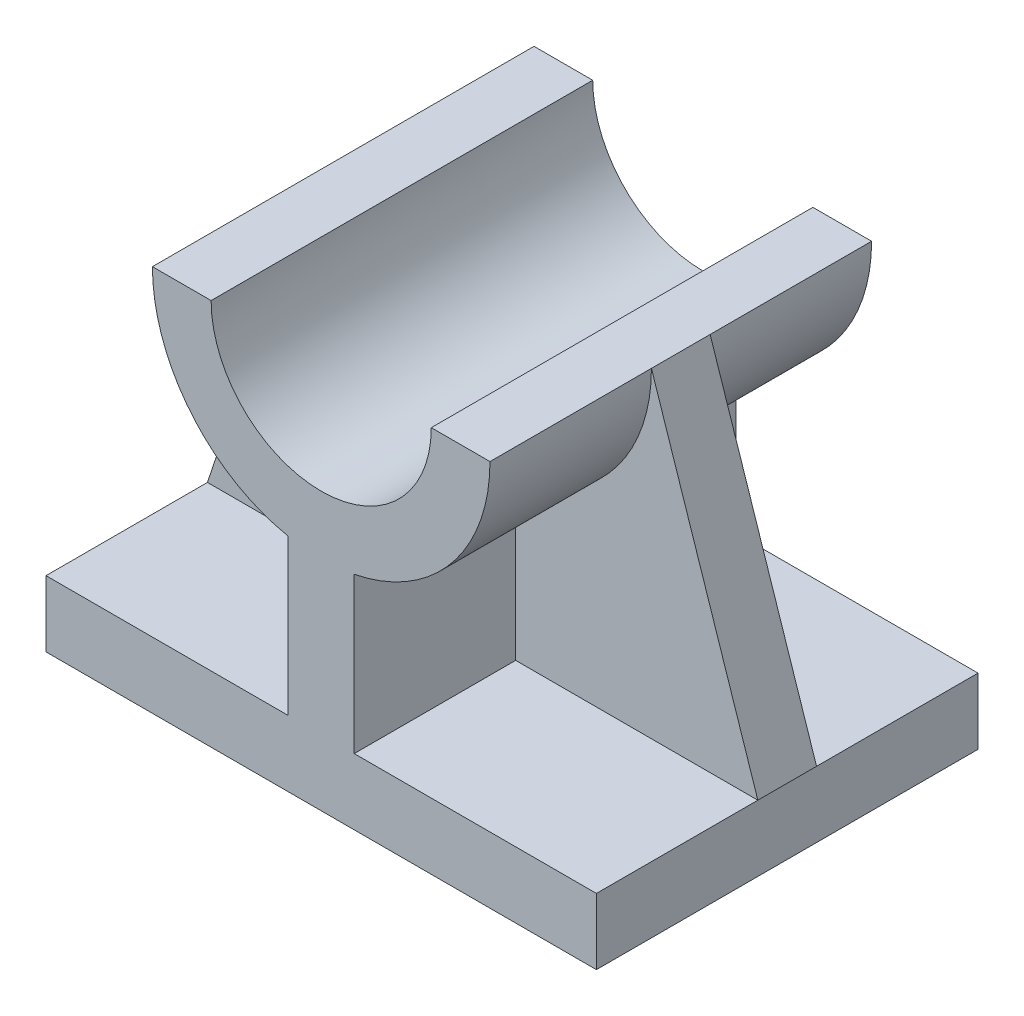
ISO-10303-21;
HEADER;
FILE_DESCRIPTION(('STEP AP214'),'2;1');
FILE_NAME('part.step','',(''),(''),'','','');
FILE_SCHEMA(('AUTOMOTIVE_DESIGN { 1 0 10303 214 1 1 1 1 }'));
ENDSEC;
DATA;
#1=APPLICATION_CONTEXT('core data for automotive mechanical design processes');
#2=APPLICATION_PROTOCOL_DEFINITION('international standard','automotive_design',2000,#1);
#3=PRODUCT_CONTEXT('',#1,'mechanical');
#4=PRODUCT('Part','Part','',(#3));
#5=PRODUCT_RELATED_PRODUCT_CATEGORY('part','',(#4));
#6=PRODUCT_DEFINITION_FORMATION('','',#4);
#7=PRODUCT_DEFINITION_CONTEXT('part definition',#1,'design');
#8=PRODUCT_DEFINITION('design','',#6,#7);
#9=PRODUCT_DEFINITION_SHAPE('','',#8);
#10=(LENGTH_UNIT() NAMED_UNIT(*) SI_UNIT(.MILLI.,.METRE.));
#11=(NAMED_UNIT(*) PLANE_ANGLE_UNIT() SI_UNIT($,.RADIAN.));
#12=(NAMED_UNIT(*) SI_UNIT($,.STERADIAN.) SOLID_ANGLE_UNIT());
#13=UNCERTAINTY_MEASURE_WITH_UNIT(LENGTH_MEASURE(1.E-05),#10,'distance_accuracy_value','');
#14=(GEOMETRIC_REPRESENTATION_CONTEXT(3) GLOBAL_UNCERTAINTY_ASSIGNED_CONTEXT((#13)) GLOBAL_UNIT_ASSIGNED_CONTEXT((#10,
#11,#12)) REPRESENTATION_CONTEXT('',''));
#15=CARTESIAN_POINT('',(0.,0.,0.));
#16=DIRECTION('',(0.,0.,1.));
#17=DIRECTION('',(1.,0.,0.));
#18=AXIS2_PLACEMENT_3D('',#15,#16,#17);
#19=CARTESIAN_POINT('',(0.,16.3928571428572,26.));
#20=DIRECTION('',(0.,0.,-1.));
#21=DIRECTION('',(-1.,0.,0.));
#22=AXIS2_PLACEMENT_3D('',#19,#20,#21);
#23=CYLINDRICAL_SURFACE('',#22,23.);
#24=CARTESIAN_POINT('',(0.,16.3928571428572,-4.));
#25=DIRECTION('',(0.,0.,1.));
#26=DIRECTION('',(1.,0.,0.));
#27=AXIS2_PLACEMENT_3D('',#24,#25,#26);
#28=CIRCLE('',#27,23.);
#29=CARTESIAN_POINT('',(-23.,16.3928571428572,-3.99999999999999));
#30=VERTEX_POINT('',#29);
#31=CARTESIAN_POINT('',(-4.50000000000001,-6.16262999442277,-3.99999999999999));
#32=VERTEX_POINT('',#31);
#33=EDGE_CURVE('E53',#30,#32,#28,.T.);
#34=ORIENTED_EDGE('',*,*,#33,.F.);
#35=DIRECTION('',(0.,0.,-1.));
#36=VECTOR('',#35,1.);
#37=CARTESIAN_POINT('',(-23.,16.3928571428572,26.));
#38=LINE('',#37,#36);
#39=CARTESIAN_POINT('',(-23.,16.3928571428572,-26.));
#40=VERTEX_POINT('',#39);
#41=EDGE_CURVE('E309',#30,#40,#38,.T.);
#42=ORIENTED_EDGE('',*,*,#41,.T.);
#43=CARTESIAN_POINT('',(0.,16.3928571428572,-26.));
#44=DIRECTION('',(0.,0.,1.));
#45=DIRECTION('',(1.,0.,0.));
#46=AXIS2_PLACEMENT_3D('',#43,#44,#45);
#47=CIRCLE('',#46,23.);
#48=CARTESIAN_POINT('',(-4.50000000000001,-6.16262999442277,-26.));
#49=VERTEX_POINT('',#48);
#50=EDGE_CURVE('E293',#40,#49,#47,.T.);
#51=ORIENTED_EDGE('',*,*,#50,.T.);
#52=DIRECTION('',(0.,0.,-1.));
#53=VECTOR('',#52,1.);
#54=CARTESIAN_POINT('',(-4.50000000000001,-6.16262999442277,26.));
#55=LINE('',#54,#53);
#56=EDGE_CURVE('E308',#32,#49,#55,.T.);
#57=ORIENTED_EDGE('',*,*,#56,.F.);
#58=EDGE_LOOP('',(#34,#42,#51,#57));
#59=FACE_BOUND('',#58,.T.);
#60=ADVANCED_FACE('F39',(#59),#23,.T.);
#61=CARTESIAN_POINT('',(-4.5,-27.3214285714286,26.));
#62=DIRECTION('',(1.,0.,0.));
#63=DIRECTION('',(0.,1.,0.));
#64=AXIS2_PLACEMENT_3D('',#61,#62,#63);
#65=PLANE('',#64);
#66=DIRECTION('',(0.,-1.,0.));
#67=VECTOR('',#66,1.);
#68=CARTESIAN_POINT('',(-4.5,-27.3214285714286,-4.));
#69=LINE('',#68,#67);
#70=CARTESIAN_POINT('',(-4.5,-27.3214285714286,-3.99999999999999));
#71=VERTEX_POINT('',#70);
#72=EDGE_CURVE('E204',#32,#71,#69,.T.);
#73=ORIENTED_EDGE('',*,*,#72,.F.);
#74=ORIENTED_EDGE('',*,*,#56,.T.);
#75=DIRECTION('',(0.,-1.,0.));
#76=VECTOR('',#75,1.);
#77=CARTESIAN_POINT('',(-4.5,-27.3214285714286,-26.));
#78=LINE('',#77,#76);
#79=CARTESIAN_POINT('',(-4.5,-27.3214285714286,-26.));
#80=VERTEX_POINT('',#79);
#81=EDGE_CURVE('E299',#49,#80,#78,.T.);
#82=ORIENTED_EDGE('',*,*,#81,.T.);
#83=DIRECTION('',(0.,0.,-1.));
#84=VECTOR('',#83,1.);
#85=CARTESIAN_POINT('',(-4.5,-27.3214285714286,26.));
#86=LINE('',#85,#84);
#87=EDGE_CURVE('E302',#71,#80,#86,.T.);
#88=ORIENTED_EDGE('',*,*,#87,.F.);
#89=EDGE_LOOP('',(#73,#74,#82,#88));
#90=FACE_BOUND('',#89,.T.);
#91=ADVANCED_FACE('F370',(#90),#65,.F.);
#92=CARTESIAN_POINT('',(-37.5,-27.3214285714286,26.));
#93=DIRECTION('',(0.,-1.,0.));
#94=DIRECTION('',(0.,0.,-1.));
#95=AXIS2_PLACEMENT_3D('',#92,#93,#94);
#96=PLANE('',#95);
#97=DIRECTION('',(-1.,0.,0.));
#98=VECTOR('',#97,1.);
#99=CARTESIAN_POINT('',(-37.5,-27.3214285714286,-4.));
#100=LINE('',#99,#98);
#101=CARTESIAN_POINT('',(-37.5,-27.3214285714286,-4.));
#102=VERTEX_POINT('',#101);
#103=EDGE_CURVE('E194',#71,#102,#100,.T.);
#104=ORIENTED_EDGE('',*,*,#103,.F.);
#105=ORIENTED_EDGE('',*,*,#87,.T.);
#106=DIRECTION('',(-1.,0.,0.));
#107=VECTOR('',#106,1.);
#108=CARTESIAN_POINT('',(-37.5,-27.3214285714286,-26.));
#109=LINE('',#108,#107);
#110=CARTESIAN_POINT('',(-37.5,-27.3214285714286,-26.));
#111=VERTEX_POINT('',#110);
#112=EDGE_CURVE('E198',#80,#111,#109,.T.);
#113=ORIENTED_EDGE('',*,*,#112,.T.);
#114=DIRECTION('',(0.,0.,-1.));
#115=VECTOR('',#114,1.);
#116=CARTESIAN_POINT('',(-37.5,-27.3214285714286,26.));
#117=LINE('',#116,#115);
#118=EDGE_CURVE('E180',#102,#111,#117,.T.);
#119=ORIENTED_EDGE('',*,*,#118,.F.);
#120=EDGE_LOOP('',(#104,#105,#113,#119));
#121=FACE_BOUND('',#120,.T.);
#122=ADVANCED_FACE('F192',(#121),#96,.F.);
#123=CARTESIAN_POINT('',(4.5,-27.3214285714286,26.));
#124=DIRECTION('',(0.,-1.,0.));
#125=DIRECTION('',(0.,0.,-1.));
#126=AXIS2_PLACEMENT_3D('',#123,#124,#125);
#127=PLANE('',#126);
#128=DIRECTION('',(-1.,0.,0.));
#129=VECTOR('',#128,1.);
#130=CARTESIAN_POINT('',(4.5,-27.3214285714286,-4.));
#131=LINE('',#130,#129);
#132=CARTESIAN_POINT('',(37.5,-27.3214285714286,-4.));
#133=VERTEX_POINT('',#132);
#134=CARTESIAN_POINT('',(4.5,-27.3214285714286,-4.));
#135=VERTEX_POINT('',#134);
#136=EDGE_CURVE('E231',#133,#135,#131,.T.);
#137=ORIENTED_EDGE('',*,*,#136,.F.);
#138=DIRECTION('',(0.,0.,-1.));
#139=VECTOR('',#138,1.);
#140=CARTESIAN_POINT('',(37.5,-27.3214285714286,26.));
#141=LINE('',#140,#139);
#142=CARTESIAN_POINT('',(37.5,-27.3214285714286,-26.));
#143=VERTEX_POINT('',#142);
#144=EDGE_CURVE('E329',#133,#143,#141,.T.);
#145=ORIENTED_EDGE('',*,*,#144,.T.);
#146=DIRECTION('',(-1.,0.,0.));
#147=VECTOR('',#146,1.);
#148=CARTESIAN_POINT('',(4.5,-27.3214285714286,-26.));
#149=LINE('',#148,#147);
#150=CARTESIAN_POINT('',(4.5,-27.3214285714286,-26.));
#151=VERTEX_POINT('',#150);
#152=EDGE_CURVE('E280',#143,#151,#149,.T.);
#153=ORIENTED_EDGE('',*,*,#152,.T.);
#154=DIRECTION('',(0.,0.,-1.));
#155=VECTOR('',#154,1.);
#156=CARTESIAN_POINT('',(4.5,-27.3214285714286,26.));
#157=LINE('',#156,#155);
#158=EDGE_CURVE('E326',#135,#151,#157,.T.);
#159=ORIENTED_EDGE('',*,*,#158,.F.);
#160=EDGE_LOOP('',(#137,#145,#153,#159));
#161=FACE_BOUND('',#160,.T.);
#162=ADVANCED_FACE('F355',(#161),#127,.F.);
#163=CARTESIAN_POINT('',(4.5,-27.3214285714286,26.));
#164=DIRECTION('',(-1.,0.,0.));
#165=DIRECTION('',(0.,-1.,0.));
#166=AXIS2_PLACEMENT_3D('',#163,#164,#165);
#167=PLANE('',#166);
#168=DIRECTION('',(0.,1.,0.));
#169=VECTOR('',#168,1.);
#170=CARTESIAN_POINT('',(4.5,-27.3214285714286,-4.));
#171=LINE('',#170,#169);
#172=CARTESIAN_POINT('',(4.50000000000001,-6.16262999442277,-4.));
#173=VERTEX_POINT('',#172);
#174=EDGE_CURVE('E226',#135,#173,#171,.T.);
#175=ORIENTED_EDGE('',*,*,#174,.F.);
#176=ORIENTED_EDGE('',*,*,#158,.T.);
#177=DIRECTION('',(0.,1.,0.));
#178=VECTOR('',#177,1.);
#179=CARTESIAN_POINT('',(4.5,-27.3214285714286,-26.));
#180=LINE('',#179,#178);
#181=CARTESIAN_POINT('',(4.50000000000001,-6.16262999442277,-26.));
#182=VERTEX_POINT('',#181);
#183=EDGE_CURVE('E278',#151,#182,#180,.T.);
#184=ORIENTED_EDGE('',*,*,#183,.T.);
#185=DIRECTION('',(0.,0.,-1.));
#186=VECTOR('',#185,1.);
#187=CARTESIAN_POINT('',(4.50000000000001,-6.16262999442277,26.));
#188=LINE('',#187,#186);
#189=EDGE_CURVE('E321',#173,#182,#188,.T.);
#190=ORIENTED_EDGE('',*,*,#189,.F.);
#191=EDGE_LOOP('',(#175,#176,#184,#190));
#192=FACE_BOUND('',#191,.T.);
#193=ADVANCED_FACE('F389',(#192),#167,.F.);
#194=CARTESIAN_POINT('',(0.,16.3928571428572,26.));
#195=DIRECTION('',(0.,0.,-1.));
#196=DIRECTION('',(-1.,0.,0.));
#197=AXIS2_PLACEMENT_3D('',#194,#195,#196);
#198=CYLINDRICAL_SURFACE('',#197,23.);
#199=CARTESIAN_POINT('',(0.,16.3928571428572,-4.));
#200=DIRECTION('',(0.,0.,1.));
#201=DIRECTION('',(1.,0.,0.));
#202=AXIS2_PLACEMENT_3D('',#199,#200,#201);
#203=CIRCLE('',#202,23.);
#204=CARTESIAN_POINT('',(23.,16.3928571428572,-3.99999999999999));
#205=VERTEX_POINT('',#204);
#206=EDGE_CURVE('E221',#173,#205,#203,.T.);
#207=ORIENTED_EDGE('',*,*,#206,.F.);
#208=ORIENTED_EDGE('',*,*,#189,.T.);
#209=CARTESIAN_POINT('',(0.,16.3928571428572,-26.));
#210=DIRECTION('',(0.,0.,1.));
#211=DIRECTION('',(1.,0.,0.));
#212=AXIS2_PLACEMENT_3D('',#209,#210,#211);
#213=CIRCLE('',#212,23.);
#214=CARTESIAN_POINT('',(23.,16.3928571428572,-26.));
#215=VERTEX_POINT('',#214);
#216=EDGE_CURVE('E284',#182,#215,#213,.T.);
#217=ORIENTED_EDGE('',*,*,#216,.T.);
#218=DIRECTION('',(0.,0.,-1.));
#219=VECTOR('',#218,1.);
#220=CARTESIAN_POINT('',(23.,16.3928571428572,26.));
#221=LINE('',#220,#219);
#222=EDGE_CURVE('E320',#205,#215,#221,.T.);
#223=ORIENTED_EDGE('',*,*,#222,.F.);
#224=EDGE_LOOP('',(#207,#208,#217,#223));
#225=FACE_BOUND('',#224,.T.);
#226=ADVANCED_FACE('F383',(#225),#198,.T.);
#227=CARTESIAN_POINT('',(-37.5,-27.3214285714286,26.));
#228=DIRECTION('',(1.,0.,0.));
#229=DIRECTION('',(0.,1.,0.));
#230=AXIS2_PLACEMENT_3D('',#227,#228,#229);
#231=PLANE('',#230);
#232=CARTESIAN_POINT('',(-37.5,-27.3214285714286,26.));
#233=VERTEX_POINT('',#232);
#234=CARTESIAN_POINT('',(-37.5,-27.3214285714286,4.00000000000001));
#235=VERTEX_POINT('',#234);
#236=EDGE_CURVE('E184',#233,#235,#117,.T.);
#237=ORIENTED_EDGE('',*,*,#236,.T.);
#238=EDGE_CURVE('E177',#235,#102,#117,.T.);
#239=ORIENTED_EDGE('',*,*,#238,.T.);
#240=ORIENTED_EDGE('',*,*,#118,.T.);
#241=DIRECTION('',(0.,-1.,0.));
#242=VECTOR('',#241,1.);
#243=CARTESIAN_POINT('',(-37.5,-27.3214285714286,-26.));
#244=LINE('',#243,#242);
#245=CARTESIAN_POINT('',(-37.5,-36.3214285714286,-26.));
#246=VERTEX_POINT('',#245);
#247=EDGE_CURVE('E243',#111,#246,#244,.T.);
#248=ORIENTED_EDGE('',*,*,#247,.T.);
#249=DIRECTION('',(0.,0.,-1.));
#250=VECTOR('',#249,1.);
#251=CARTESIAN_POINT('',(-37.5,-36.3214285714286,26.));
#252=LINE('',#251,#250);
#253=CARTESIAN_POINT('',(-37.5,-36.3214285714286,26.));
#254=VERTEX_POINT('',#253);
#255=EDGE_CURVE('E11',#254,#246,#252,.T.);
#256=ORIENTED_EDGE('',*,*,#255,.F.);
#257=DIRECTION('',(0.,-1.,0.));
#258=VECTOR('',#257,1.);
#259=CARTESIAN_POINT('',(-37.5,-27.3214285714286,26.));
#260=LINE('',#259,#258);
#261=EDGE_CURVE('E246',#233,#254,#260,.T.);
#262=ORIENTED_EDGE('',*,*,#261,.F.);
#263=EDGE_LOOP('',(#237,#239,#240,#248,#256,#262));
#264=FACE_BOUND('',#263,.T.);
#265=ADVANCED_FACE('F41',(#264),#231,.F.);
#266=CARTESIAN_POINT('',(-37.5,-36.3214285714286,26.));
#267=DIRECTION('',(0.,1.,0.));
#268=DIRECTION('',(0.,0.,1.));
#269=AXIS2_PLACEMENT_3D('',#266,#267,#268);
#270=PLANE('',#269);
#271=ORIENTED_EDGE('',*,*,#255,.T.);
#272=DIRECTION('',(1.,0.,0.));
#273=VECTOR('',#272,1.);
#274=CARTESIAN_POINT('',(-37.5,-36.3214285714286,-26.));
#275=LINE('',#274,#273);
#276=CARTESIAN_POINT('',(37.5,-36.3214285714286,-26.));
#277=VERTEX_POINT('',#276);
#278=EDGE_CURVE('E271',#246,#277,#275,.T.);
#279=ORIENTED_EDGE('',*,*,#278,.T.);
#280=DIRECTION('',(0.,0.,-1.));
#281=VECTOR('',#280,1.);
#282=CARTESIAN_POINT('',(37.5,-36.3214285714286,26.));
#283=LINE('',#282,#281);
#284=CARTESIAN_POINT('',(37.5,-36.3214285714286,26.));
#285=VERTEX_POINT('',#284);
#286=EDGE_CURVE('E50',#285,#277,#283,.T.);
#287=ORIENTED_EDGE('',*,*,#286,.F.);
#288=DIRECTION('',(1.,0.,0.));
#289=VECTOR('',#288,1.);
#290=CARTESIAN_POINT('',(-37.5,-36.3214285714286,26.));
#291=LINE('',#290,#289);
#292=EDGE_CURVE('E248',#254,#285,#291,.T.);
#293=ORIENTED_EDGE('',*,*,#292,.F.);
#294=EDGE_LOOP('',(#271,#279,#287,#293));
#295=FACE_BOUND('',#294,.T.);
#296=ADVANCED_FACE('F344',(#295),#270,.F.);
#297=CARTESIAN_POINT('',(37.5,-27.3214285714286,26.));
#298=DIRECTION('',(-1.,0.,0.));
#299=DIRECTION('',(0.,-1.,0.));
#300=AXIS2_PLACEMENT_3D('',#297,#298,#299);
#301=PLANE('',#300);
#302=ORIENTED_EDGE('',*,*,#286,.T.);
#303=DIRECTION('',(0.,1.,0.));
#304=VECTOR('',#303,1.);
#305=CARTESIAN_POINT('',(37.5,-27.3214285714286,-26.));
#306=LINE('',#305,#304);
#307=EDGE_CURVE('E273',#277,#143,#306,.T.);
#308=ORIENTED_EDGE('',*,*,#307,.T.);
#309=ORIENTED_EDGE('',*,*,#144,.F.);
#310=DIRECTION('',(0.,0.,-1.));
#311=VECTOR('',#310,1.);
#312=CARTESIAN_POINT('',(37.5,-27.3214285714286,26.));
#313=LINE('',#312,#311);
#314=CARTESIAN_POINT('',(37.5,-27.3214285714286,4.));
#315=VERTEX_POINT('',#314);
#316=EDGE_CURVE('E245',#133,#315,#313,.F.);
#317=ORIENTED_EDGE('',*,*,#316,.T.);
#318=CARTESIAN_POINT('',(37.5,-27.3214285714286,26.));
#319=VERTEX_POINT('',#318);
#320=EDGE_CURVE('E332',#319,#315,#141,.T.);
#321=ORIENTED_EDGE('',*,*,#320,.F.);
#322=DIRECTION('',(0.,1.,0.));
#323=VECTOR('',#322,1.);
#324=CARTESIAN_POINT('',(37.5,-27.3214285714286,26.));
#325=LINE('',#324,#323);
#326=EDGE_CURVE('E253',#285,#319,#325,.T.);
#327=ORIENTED_EDGE('',*,*,#326,.F.);
#328=EDGE_LOOP('',(#302,#308,#309,#317,#321,#327));
#329=FACE_BOUND('',#328,.T.);
#330=ADVANCED_FACE('F337',(#329),#301,.F.);
#331=ORIENTED_EDGE('',*,*,#320,.T.);
#332=DIRECTION('',(-1.,0.,0.));
#333=VECTOR('',#332,1.);
#334=CARTESIAN_POINT('',(4.5,-27.3214285714286,4.));
#335=LINE('',#334,#333);
#336=CARTESIAN_POINT('',(4.5,-27.3214285714286,4.));
#337=VERTEX_POINT('',#336);
#338=EDGE_CURVE('E239',#315,#337,#335,.T.);
#339=ORIENTED_EDGE('',*,*,#338,.T.);
#340=CARTESIAN_POINT('',(4.5,-27.3214285714286,26.));
#341=VERTEX_POINT('',#340);
#342=EDGE_CURVE('E330',#341,#337,#157,.T.);
#343=ORIENTED_EDGE('',*,*,#342,.F.);
#344=DIRECTION('',(-1.,0.,0.));
#345=VECTOR('',#344,1.);
#346=CARTESIAN_POINT('',(4.5,-27.3214285714286,26.));
#347=LINE('',#346,#345);
#348=EDGE_CURVE('E251',#319,#341,#347,.T.);
#349=ORIENTED_EDGE('',*,*,#348,.F.);
#350=EDGE_LOOP('',(#331,#339,#343,#349));
#351=FACE_BOUND('',#350,.T.);
#352=ADVANCED_FACE('F356',(#351),#127,.F.);
#353=ORIENTED_EDGE('',*,*,#342,.T.);
#354=DIRECTION('',(0.,1.,0.));
#355=VECTOR('',#354,1.);
#356=CARTESIAN_POINT('',(4.5,-27.3214285714286,4.));
#357=LINE('',#356,#355);
#358=CARTESIAN_POINT('',(4.50000000000001,-6.16262999442277,4.));
#359=VERTEX_POINT('',#358);
#360=EDGE_CURVE('E237',#337,#359,#357,.T.);
#361=ORIENTED_EDGE('',*,*,#360,.T.);
#362=CARTESIAN_POINT('',(4.50000000000001,-6.16262999442277,26.));
#363=VERTEX_POINT('',#362);
#364=EDGE_CURVE('E323',#363,#359,#188,.T.);
#365=ORIENTED_EDGE('',*,*,#364,.F.);
#366=DIRECTION('',(0.,1.,0.));
#367=VECTOR('',#366,1.);
#368=CARTESIAN_POINT('',(4.5,-27.3214285714286,26.));
#369=LINE('',#368,#367);
#370=EDGE_CURVE('E254',#341,#363,#369,.T.);
#371=ORIENTED_EDGE('',*,*,#370,.F.);
#372=EDGE_LOOP('',(#353,#361,#365,#371));
#373=FACE_BOUND('',#372,.T.);
#374=ADVANCED_FACE('F441',(#373),#167,.F.);
#375=ORIENTED_EDGE('',*,*,#364,.T.);
#376=CARTESIAN_POINT('',(0.,16.3928571428572,4.));
#377=DIRECTION('',(0.,0.,1.));
#378=DIRECTION('',(1.,0.,0.));
#379=AXIS2_PLACEMENT_3D('',#376,#377,#378);
#380=CIRCLE('',#379,23.);
#381=CARTESIAN_POINT('',(23.,16.3928571428572,4.));
#382=VERTEX_POINT('',#381);
#383=EDGE_CURVE('E234',#359,#382,#380,.T.);
#384=ORIENTED_EDGE('',*,*,#383,.T.);
#385=CARTESIAN_POINT('',(23.,16.3928571428572,26.));
#386=VERTEX_POINT('',#385);
#387=EDGE_CURVE('E318',#386,#382,#221,.T.);
#388=ORIENTED_EDGE('',*,*,#387,.F.);
#389=CARTESIAN_POINT('',(0.,16.3928571428572,26.));
#390=DIRECTION('',(0.,0.,1.));
#391=DIRECTION('',(1.,0.,0.));
#392=AXIS2_PLACEMENT_3D('',#389,#390,#391);
#393=CIRCLE('',#392,23.);
#394=EDGE_CURVE('E260',#363,#386,#393,.T.);
#395=ORIENTED_EDGE('',*,*,#394,.F.);
#396=EDGE_LOOP('',(#375,#384,#388,#395));
#397=FACE_BOUND('',#396,.T.);
#398=ADVANCED_FACE('F397',(#397),#198,.T.);
#399=CARTESIAN_POINT('',(15.,16.3928571428572,26.));
#400=DIRECTION('',(0.,-1.,0.));
#401=DIRECTION('',(0.,0.,-1.));
#402=AXIS2_PLACEMENT_3D('',#399,#400,#401);
#403=PLANE('',#402);
#404=ORIENTED_EDGE('',*,*,#387,.T.);
#405=EDGE_CURVE('E325',#382,#205,#221,.T.);
#406=ORIENTED_EDGE('',*,*,#405,.T.);
#407=ORIENTED_EDGE('',*,*,#222,.T.);
#408=DIRECTION('',(-1.,0.,0.));
#409=VECTOR('',#408,1.);
#410=CARTESIAN_POINT('',(15.,16.3928571428572,-26.));
#411=LINE('',#410,#409);
#412=CARTESIAN_POINT('',(15.,16.3928571428572,-26.));
#413=VERTEX_POINT('',#412);
#414=EDGE_CURVE('E286',#215,#413,#411,.T.);
#415=ORIENTED_EDGE('',*,*,#414,.T.);
#416=DIRECTION('',(0.,0.,-1.));
#417=VECTOR('',#416,1.);
#418=CARTESIAN_POINT('',(15.,16.3928571428572,26.));
#419=LINE('',#418,#417);
#420=CARTESIAN_POINT('',(15.,16.3928571428572,26.));
#421=VERTEX_POINT('',#420);
#422=EDGE_CURVE('E312',#421,#413,#419,.T.);
#423=ORIENTED_EDGE('',*,*,#422,.F.);
#424=DIRECTION('',(-1.,0.,0.));
#425=VECTOR('',#424,1.);
#426=CARTESIAN_POINT('',(15.,16.3928571428572,26.));
#427=LINE('',#426,#425);
#428=EDGE_CURVE('E259',#386,#421,#427,.T.);
#429=ORIENTED_EDGE('',*,*,#428,.F.);
#430=EDGE_LOOP('',(#404,#406,#407,#415,#423,#429));
#431=FACE_BOUND('',#430,.T.);
#432=ADVANCED_FACE('F377',(#431),#403,.F.);
#433=CARTESIAN_POINT('',(0.,16.3928571428572,26.));
#434=DIRECTION('',(0.,0.,-1.));
#435=DIRECTION('',(-1.,0.,0.));
#436=AXIS2_PLACEMENT_3D('',#433,#434,#435);
#437=CYLINDRICAL_SURFACE('',#436,15.);
#438=ORIENTED_EDGE('',*,*,#422,.T.);
#439=CARTESIAN_POINT('',(0.,16.3928571428572,-26.));
#440=DIRECTION('',(0.,0.,-1.));
#441=DIRECTION('',(1.,0.,0.));
#442=AXIS2_PLACEMENT_3D('',#439,#440,#441);
#443=CIRCLE('',#442,15.);
#444=CARTESIAN_POINT('',(-15.,16.3928571428572,-26.));
#445=VERTEX_POINT('',#444);
#446=EDGE_CURVE('E288',#413,#445,#443,.T.);
#447=ORIENTED_EDGE('',*,*,#446,.T.);
#448=DIRECTION('',(0.,0.,-1.));
#449=VECTOR('',#448,1.);
#450=CARTESIAN_POINT('',(-15.,16.3928571428572,26.));
#451=LINE('',#450,#449);
#452=CARTESIAN_POINT('',(-15.,16.3928571428572,26.));
#453=VERTEX_POINT('',#452);
#454=EDGE_CURVE('E311',#453,#445,#451,.T.);
#455=ORIENTED_EDGE('',*,*,#454,.F.);
#456=CARTESIAN_POINT('',(0.,16.3928571428572,26.));
#457=DIRECTION('',(0.,0.,-1.));
#458=DIRECTION('',(1.,0.,0.));
#459=AXIS2_PLACEMENT_3D('',#456,#457,#458);
#460=CIRCLE('',#459,15.);
#461=EDGE_CURVE('E261',#421,#453,#460,.T.);
#462=ORIENTED_EDGE('',*,*,#461,.F.);
#463=EDGE_LOOP('',(#438,#447,#455,#462));
#464=FACE_BOUND('',#463,.T.);
#465=ADVANCED_FACE('F372',(#464),#437,.F.);
#466=CARTESIAN_POINT('',(-23.,16.3928571428572,26.));
#467=DIRECTION('',(0.,-1.,0.));
#468=DIRECTION('',(0.,0.,-1.));
#469=AXIS2_PLACEMENT_3D('',#466,#467,#468);
#470=PLANE('',#469);
#471=ORIENTED_EDGE('',*,*,#454,.T.);
#472=DIRECTION('',(-1.,0.,0.));
#473=VECTOR('',#472,1.);
#474=CARTESIAN_POINT('',(-23.,16.3928571428572,-26.));
#475=LINE('',#474,#473);
#476=EDGE_CURVE('E295',#445,#40,#475,.T.);
#477=ORIENTED_EDGE('',*,*,#476,.T.);
#478=ORIENTED_EDGE('',*,*,#41,.F.);
#479=DIRECTION('',(0.,0.,-1.));
#480=VECTOR('',#479,1.);
#481=CARTESIAN_POINT('',(-23.,16.3928571428572,26.));
#482=LINE('',#481,#480);
#483=CARTESIAN_POINT('',(-23.,16.3928571428572,4.00000000000001));
#484=VERTEX_POINT('',#483);
#485=EDGE_CURVE('E62',#30,#484,#482,.F.);
#486=ORIENTED_EDGE('',*,*,#485,.T.);
#487=CARTESIAN_POINT('',(-23.,16.3928571428572,26.));
#488=VERTEX_POINT('',#487);
#489=EDGE_CURVE('E313',#488,#484,#38,.T.);
#490=ORIENTED_EDGE('',*,*,#489,.F.);
#491=DIRECTION('',(-1.,0.,0.));
#492=VECTOR('',#491,1.);
#493=CARTESIAN_POINT('',(-23.,16.3928571428572,26.));
#494=LINE('',#493,#492);
#495=EDGE_CURVE('E263',#453,#488,#494,.T.);
#496=ORIENTED_EDGE('',*,*,#495,.F.);
#497=EDGE_LOOP('',(#471,#477,#478,#486,#490,#496));
#498=FACE_BOUND('',#497,.T.);
#499=ADVANCED_FACE('F366',(#498),#470,.F.);
#500=ORIENTED_EDGE('',*,*,#489,.T.);
#501=CARTESIAN_POINT('',(0.,16.3928571428572,4.));
#502=DIRECTION('',(0.,0.,1.));
#503=DIRECTION('',(1.,0.,0.));
#504=AXIS2_PLACEMENT_3D('',#501,#502,#503);
#505=CIRCLE('',#504,23.);
#506=CARTESIAN_POINT('',(-4.50000000000001,-6.16262999442277,4.00000000000001));
#507=VERTEX_POINT('',#506);
#508=EDGE_CURVE('E213',#484,#507,#505,.T.);
#509=ORIENTED_EDGE('',*,*,#508,.T.);
#510=CARTESIAN_POINT('',(-4.50000000000001,-6.16262999442277,26.));
#511=VERTEX_POINT('',#510);
#512=EDGE_CURVE('E307',#511,#507,#55,.T.);
#513=ORIENTED_EDGE('',*,*,#512,.F.);
#514=CARTESIAN_POINT('',(0.,16.3928571428572,26.));
#515=DIRECTION('',(0.,0.,1.));
#516=DIRECTION('',(1.,0.,0.));
#517=AXIS2_PLACEMENT_3D('',#514,#515,#516);
#518=CIRCLE('',#517,23.);
#519=EDGE_CURVE('E264',#488,#511,#518,.T.);
#520=ORIENTED_EDGE('',*,*,#519,.F.);
#521=EDGE_LOOP('',(#500,#509,#513,#520));
#522=FACE_BOUND('',#521,.T.);
#523=ADVANCED_FACE('F401',(#522),#23,.T.);
#524=ORIENTED_EDGE('',*,*,#512,.T.);
#525=DIRECTION('',(0.,-1.,0.));
#526=VECTOR('',#525,1.);
#527=CARTESIAN_POINT('',(-4.5,-27.3214285714286,4.));
#528=LINE('',#527,#526);
#529=CARTESIAN_POINT('',(-4.5,-27.3214285714286,4.00000000000001));
#530=VERTEX_POINT('',#529);
#531=EDGE_CURVE('E214',#507,#530,#528,.T.);
#532=ORIENTED_EDGE('',*,*,#531,.T.);
#533=CARTESIAN_POINT('',(-4.5,-27.3214285714286,26.));
#534=VERTEX_POINT('',#533);
#535=EDGE_CURVE('E304',#534,#530,#86,.T.);
#536=ORIENTED_EDGE('',*,*,#535,.F.);
#537=DIRECTION('',(0.,-1.,0.));
#538=VECTOR('',#537,1.);
#539=CARTESIAN_POINT('',(-4.5,-27.3214285714286,26.));
#540=LINE('',#539,#538);
#541=EDGE_CURVE('E270',#511,#534,#540,.T.);
#542=ORIENTED_EDGE('',*,*,#541,.F.);
#543=EDGE_LOOP('',(#524,#532,#536,#542));
#544=FACE_BOUND('',#543,.T.);
#545=ADVANCED_FACE('F409',(#544),#65,.F.);
#546=ORIENTED_EDGE('',*,*,#535,.T.);
#547=DIRECTION('',(-1.,0.,0.));
#548=VECTOR('',#547,1.);
#549=CARTESIAN_POINT('',(-37.5,-27.3214285714286,4.));
#550=LINE('',#549,#548);
#551=EDGE_CURVE('E220',#530,#235,#550,.T.);
#552=ORIENTED_EDGE('',*,*,#551,.T.);
#553=ORIENTED_EDGE('',*,*,#236,.F.);
#554=DIRECTION('',(-1.,0.,0.));
#555=VECTOR('',#554,1.);
#556=CARTESIAN_POINT('',(-37.5,-27.3214285714286,26.));
#557=LINE('',#556,#555);
#558=EDGE_CURVE('E196',#534,#233,#557,.T.);
#559=ORIENTED_EDGE('',*,*,#558,.F.);
#560=EDGE_LOOP('',(#546,#552,#553,#559));
#561=FACE_BOUND('',#560,.T.);
#562=ADVANCED_FACE('F411',(#561),#96,.F.);
#563=CARTESIAN_POINT('',(0.,16.3928571428572,26.));
#564=DIRECTION('',(0.,0.,1.));
#565=DIRECTION('',(1.,0.,0.));
#566=AXIS2_PLACEMENT_3D('',#563,#564,#565);
#567=PLANE('',#566);
#568=ORIENTED_EDGE('',*,*,#261,.T.);
#569=ORIENTED_EDGE('',*,*,#292,.T.);
#570=ORIENTED_EDGE('',*,*,#326,.T.);
#571=ORIENTED_EDGE('',*,*,#348,.T.);
#572=ORIENTED_EDGE('',*,*,#370,.T.);
#573=ORIENTED_EDGE('',*,*,#394,.T.);
#574=ORIENTED_EDGE('',*,*,#428,.T.);
#575=ORIENTED_EDGE('',*,*,#461,.T.);
#576=ORIENTED_EDGE('',*,*,#495,.T.);
#577=ORIENTED_EDGE('',*,*,#519,.T.);
#578=ORIENTED_EDGE('',*,*,#541,.T.);
#579=ORIENTED_EDGE('',*,*,#558,.T.);
#580=EDGE_LOOP('',(#568,#569,#570,#571,#572,#573,#574,#575,#576,#577,#578,#579));
#581=FACE_BOUND('',#580,.T.);
#582=ADVANCED_FACE('F360',(#581),#567,.T.);
#583=CARTESIAN_POINT('',(0.,16.3928571428572,-26.));
#584=DIRECTION('',(0.,0.,1.));
#585=DIRECTION('',(1.,0.,0.));
#586=AXIS2_PLACEMENT_3D('',#583,#584,#585);
#587=PLANE('',#586);
#588=ORIENTED_EDGE('',*,*,#247,.F.);
#589=ORIENTED_EDGE('',*,*,#112,.F.);
#590=ORIENTED_EDGE('',*,*,#81,.F.);
#591=ORIENTED_EDGE('',*,*,#50,.F.);
#592=ORIENTED_EDGE('',*,*,#476,.F.);
#593=ORIENTED_EDGE('',*,*,#446,.F.);
#594=ORIENTED_EDGE('',*,*,#414,.F.);
#595=ORIENTED_EDGE('',*,*,#216,.F.);
#596=ORIENTED_EDGE('',*,*,#183,.F.);
#597=ORIENTED_EDGE('',*,*,#152,.F.);
#598=ORIENTED_EDGE('',*,*,#307,.F.);
#599=ORIENTED_EDGE('',*,*,#278,.F.);
#600=EDGE_LOOP('',(#588,#589,#590,#591,#592,#593,#594,#595,#596,#597,#598,#599));
#601=FACE_BOUND('',#600,.T.);
#602=ADVANCED_FACE('F347',(#601),#587,.F.);
#603=CARTESIAN_POINT('',(23.,16.3928571428572,0.));
#604=DIRECTION('',(-0.94914753962214,-0.314831618534795,0.));
#605=DIRECTION('',(0.314831618534795,-0.94914753962214,0.));
#606=AXIS2_PLACEMENT_3D('',#603,#604,#605);
#607=PLANE('',#606);
#608=ORIENTED_EDGE('',*,*,#316,.F.);
#609=DIRECTION('',(0.314831618534795,-0.94914753962214,0.));
#610=VECTOR('',#609,1.);
#611=CARTESIAN_POINT('',(23.,16.3928571428572,-4.));
#612=LINE('',#611,#610);
#613=EDGE_CURVE('E219',#205,#133,#612,.T.);
#614=ORIENTED_EDGE('',*,*,#613,.F.);
#615=ORIENTED_EDGE('',*,*,#405,.F.);
#616=DIRECTION('',(0.314831618534795,-0.94914753962214,0.));
#617=VECTOR('',#616,1.);
#618=CARTESIAN_POINT('',(23.,16.3928571428572,4.));
#619=LINE('',#618,#617);
#620=EDGE_CURVE('E222',#382,#315,#619,.T.);
#621=ORIENTED_EDGE('',*,*,#620,.T.);
#622=EDGE_LOOP('',(#608,#614,#615,#621));
#623=FACE_BOUND('',#622,.T.);
#624=ADVANCED_FACE('F392',(#623),#607,.F.);
#625=CARTESIAN_POINT('',(0.,-9.96428571428571,4.));
#626=DIRECTION('',(0.,0.,1.));
#627=DIRECTION('',(1.,0.,0.));
#628=AXIS2_PLACEMENT_3D('',#625,#626,#627);
#629=PLANE('',#628);
#630=ORIENTED_EDGE('',*,*,#338,.F.);
#631=ORIENTED_EDGE('',*,*,#620,.F.);
#632=ORIENTED_EDGE('',*,*,#383,.F.);
#633=ORIENTED_EDGE('',*,*,#360,.F.);
#634=EDGE_LOOP('',(#630,#631,#632,#633));
#635=FACE_BOUND('',#634,.T.);
#636=ADVANCED_FACE('F391',(#635),#629,.T.);
#637=CARTESIAN_POINT('',(0.,-9.96428571428571,-4.));
#638=DIRECTION('',(0.,0.,1.));
#639=DIRECTION('',(1.,0.,0.));
#640=AXIS2_PLACEMENT_3D('',#637,#638,#639);
#641=PLANE('',#640);
#642=ORIENTED_EDGE('',*,*,#613,.T.);
#643=ORIENTED_EDGE('',*,*,#136,.T.);
#644=ORIENTED_EDGE('',*,*,#174,.T.);
#645=ORIENTED_EDGE('',*,*,#206,.T.);
#646=EDGE_LOOP('',(#642,#643,#644,#645));
#647=FACE_BOUND('',#646,.T.);
#648=ADVANCED_FACE('F388',(#647),#641,.F.);
#649=CARTESIAN_POINT('',(-23.,16.3928571428572,0.));
#650=DIRECTION('',(-0.94914753962214,0.314831618534795,0.));
#651=DIRECTION('',(-0.314831618534795,-0.94914753962214,0.));
#652=AXIS2_PLACEMENT_3D('',#649,#650,#651);
#653=PLANE('',#652);
#654=ORIENTED_EDGE('',*,*,#485,.F.);
#655=DIRECTION('',(-0.314831618534795,-0.94914753962214,0.));
#656=VECTOR('',#655,1.);
#657=CARTESIAN_POINT('',(-23.,16.3928571428572,-4.));
#658=LINE('',#657,#656);
#659=EDGE_CURVE('E201',#30,#102,#658,.T.);
#660=ORIENTED_EDGE('',*,*,#659,.T.);
#661=ORIENTED_EDGE('',*,*,#238,.F.);
#662=DIRECTION('',(-0.314831618534795,-0.94914753962214,0.));
#663=VECTOR('',#662,1.);
#664=CARTESIAN_POINT('',(-23.,16.3928571428572,4.));
#665=LINE('',#664,#663);
#666=EDGE_CURVE('E202',#484,#235,#665,.T.);
#667=ORIENTED_EDGE('',*,*,#666,.F.);
#668=EDGE_LOOP('',(#654,#660,#661,#667));
#669=FACE_BOUND('',#668,.T.);
#670=ADVANCED_FACE('F210',(#669),#653,.T.);
#671=CARTESIAN_POINT('',(0.,-9.96428571428571,4.));
#672=DIRECTION('',(0.,0.,1.));
#673=DIRECTION('',(1.,0.,0.));
#674=AXIS2_PLACEMENT_3D('',#671,#672,#673);
#675=PLANE('',#674);
#676=ORIENTED_EDGE('',*,*,#551,.F.);
#677=ORIENTED_EDGE('',*,*,#531,.F.);
#678=ORIENTED_EDGE('',*,*,#508,.F.);
#679=ORIENTED_EDGE('',*,*,#666,.T.);
#680=EDGE_LOOP('',(#676,#677,#678,#679));
#681=FACE_BOUND('',#680,.T.);
#682=ADVANCED_FACE('F414',(#681),#675,.T.);
#683=CARTESIAN_POINT('',(0.,-9.96428571428571,-4.));
#684=DIRECTION('',(0.,0.,1.));
#685=DIRECTION('',(1.,0.,0.));
#686=AXIS2_PLACEMENT_3D('',#683,#684,#685);
#687=PLANE('',#686);
#688=ORIENTED_EDGE('',*,*,#659,.F.);
#689=ORIENTED_EDGE('',*,*,#33,.T.);
#690=ORIENTED_EDGE('',*,*,#72,.T.);
#691=ORIENTED_EDGE('',*,*,#103,.T.);
#692=EDGE_LOOP('',(#688,#689,#690,#691));
#693=FACE_BOUND('',#692,.T.);
#694=ADVANCED_FACE('F205',(#693),#687,.F.);
#695=CLOSED_SHELL('',(#60,#91,#122,#162,#193,#226,#265,#296,#330,#352,#374,#398,#432,#465,#499,
#523,#545,#562,#582,#602,#624,#636,#648,#670,#682,#694));
#696=MANIFOLD_SOLID_BREP('B2',#695);
#697=ADVANCED_BREP_SHAPE_REPRESENTATION('',(#18,#696),#14);
#698=SHAPE_DEFINITION_REPRESENTATION(#9,#697);
ENDSEC;
END-ISO-10303-21;
